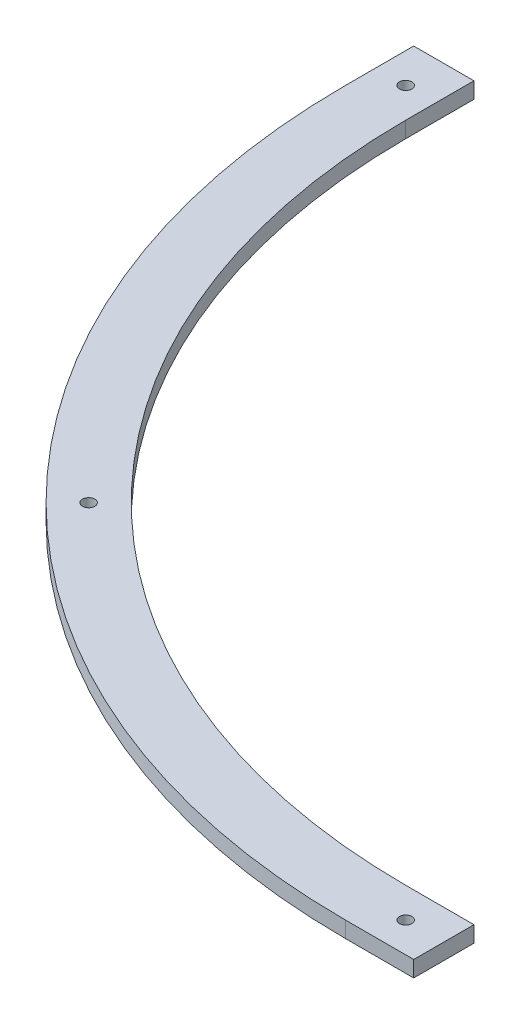
ISO-10303-21;
HEADER;
FILE_DESCRIPTION(('STEP AP214'),'2;1');
FILE_NAME('part.step','',(''),(''),'','','');
FILE_SCHEMA(('AUTOMOTIVE_DESIGN { 1 0 10303 214 1 1 1 1 }'));
ENDSEC;
DATA;
#1=APPLICATION_CONTEXT('core data for automotive mechanical design processes');
#2=APPLICATION_PROTOCOL_DEFINITION('international standard','automotive_design',2000,#1);
#3=PRODUCT_CONTEXT('',#1,'mechanical');
#4=PRODUCT('Part','Part','',(#3));
#5=PRODUCT_RELATED_PRODUCT_CATEGORY('part','',(#4));
#6=PRODUCT_DEFINITION_FORMATION('','',#4);
#7=PRODUCT_DEFINITION_CONTEXT('part definition',#1,'design');
#8=PRODUCT_DEFINITION('design','',#6,#7);
#9=PRODUCT_DEFINITION_SHAPE('','',#8);
#10=(LENGTH_UNIT() NAMED_UNIT(*) SI_UNIT(.MILLI.,.METRE.));
#11=(NAMED_UNIT(*) PLANE_ANGLE_UNIT() SI_UNIT($,.RADIAN.));
#12=(NAMED_UNIT(*) SI_UNIT($,.STERADIAN.) SOLID_ANGLE_UNIT());
#13=UNCERTAINTY_MEASURE_WITH_UNIT(LENGTH_MEASURE(1.E-05),#10,'distance_accuracy_value','');
#14=(GEOMETRIC_REPRESENTATION_CONTEXT(3) GLOBAL_UNCERTAINTY_ASSIGNED_CONTEXT((#13)) GLOBAL_UNIT_ASSIGNED_CONTEXT((#10,
#11,#12)) REPRESENTATION_CONTEXT('',''));
#15=CARTESIAN_POINT('',(0.,0.,0.));
#16=DIRECTION('',(0.,0.,1.));
#17=DIRECTION('',(1.,0.,0.));
#18=AXIS2_PLACEMENT_3D('',#15,#16,#17);
#19=CARTESIAN_POINT('',(90.,4.,-90.));
#20=DIRECTION('',(0.,1.,0.));
#21=DIRECTION('',(0.,0.,1.));
#22=AXIS2_PLACEMENT_3D('',#19,#20,#21);
#23=PLANE('',#22);
#24=CARTESIAN_POINT('',(97.5,4.,82.5));
#25=DIRECTION('',(0.,1.,0.));
#26=DIRECTION('',(0.,0.,1.));
#27=AXIS2_PLACEMENT_3D('',#24,#25,#26);
#28=CIRCLE('',#27,1.54999999999999);
#29=CARTESIAN_POINT('',(97.5,4.,84.05));
#30=VERTEX_POINT('',#29);
#31=EDGE_CURVE('E213',#30,#30,#28,.T.);
#32=ORIENTED_EDGE('',*,*,#31,.F.);
#33=EDGE_LOOP('',(#32));
#34=FACE_BOUND('',#33,.T.);
#35=CARTESIAN_POINT('',(90.,4.,-90.));
#36=DIRECTION('',(0.,1.,0.));
#37=DIRECTION('',(0.,0.,1.));
#38=AXIS2_PLACEMENT_3D('',#35,#36,#37);
#39=CIRCLE('',#38,180.);
#40=CARTESIAN_POINT('',(-90.,4.,-90.));
#41=VERTEX_POINT('',#40);
#42=CARTESIAN_POINT('',(90.,4.,90.));
#43=VERTEX_POINT('',#42);
#44=EDGE_CURVE('E164',#41,#43,#39,.T.);
#45=ORIENTED_EDGE('',*,*,#44,.T.);
#46=DIRECTION('',(1.,0.,0.));
#47=VECTOR('',#46,1.);
#48=CARTESIAN_POINT('',(90.,4.,90.));
#49=LINE('',#48,#47);
#50=CARTESIAN_POINT('',(107.,4.,90.));
#51=VERTEX_POINT('',#50);
#52=EDGE_CURVE('E100',#43,#51,#49,.T.);
#53=ORIENTED_EDGE('',*,*,#52,.T.);
#54=DIRECTION('',(0.,0.,-1.));
#55=VECTOR('',#54,1.);
#56=CARTESIAN_POINT('',(107.,4.,75.));
#57=LINE('',#56,#55);
#58=CARTESIAN_POINT('',(107.,4.,75.));
#59=VERTEX_POINT('',#58);
#60=EDGE_CURVE('E185',#51,#59,#57,.T.);
#61=ORIENTED_EDGE('',*,*,#60,.T.);
#62=DIRECTION('',(-1.,0.,0.));
#63=VECTOR('',#62,1.);
#64=CARTESIAN_POINT('',(90.,4.,75.));
#65=LINE('',#64,#63);
#66=CARTESIAN_POINT('',(90.,4.,75.));
#67=VERTEX_POINT('',#66);
#68=EDGE_CURVE('E199',#59,#67,#65,.T.);
#69=ORIENTED_EDGE('',*,*,#68,.T.);
#70=CARTESIAN_POINT('',(90.,4.,-90.));
#71=DIRECTION('',(0.,-1.,0.));
#72=DIRECTION('',(0.,0.,1.));
#73=AXIS2_PLACEMENT_3D('',#70,#71,#72);
#74=CIRCLE('',#73,165.);
#75=CARTESIAN_POINT('',(-75.,4.,-90.));
#76=VERTEX_POINT('',#75);
#77=EDGE_CURVE('E119',#67,#76,#74,.T.);
#78=ORIENTED_EDGE('',*,*,#77,.T.);
#79=DIRECTION('',(0.,0.,-1.));
#80=VECTOR('',#79,1.);
#81=CARTESIAN_POINT('',(-75.,4.,-90.));
#82=LINE('',#81,#80);
#83=CARTESIAN_POINT('',(-75.,4.,-107.));
#84=VERTEX_POINT('',#83);
#85=EDGE_CURVE('E113',#76,#84,#82,.T.);
#86=ORIENTED_EDGE('',*,*,#85,.T.);
#87=DIRECTION('',(-1.,0.,0.));
#88=VECTOR('',#87,1.);
#89=CARTESIAN_POINT('',(-90.,4.,-107.));
#90=LINE('',#89,#88);
#91=CARTESIAN_POINT('',(-90.,4.,-107.));
#92=VERTEX_POINT('',#91);
#93=EDGE_CURVE('E117',#84,#92,#90,.T.);
#94=ORIENTED_EDGE('',*,*,#93,.T.);
#95=DIRECTION('',(0.,0.,1.));
#96=VECTOR('',#95,1.);
#97=CARTESIAN_POINT('',(-90.,4.,-90.));
#98=LINE('',#97,#96);
#99=EDGE_CURVE('E57',#92,#41,#98,.T.);
#100=ORIENTED_EDGE('',*,*,#99,.T.);
#101=EDGE_LOOP('',(#45,#53,#61,#69,#78,#86,#94,#100));
#102=FACE_BOUND('',#101,.T.);
#103=CARTESIAN_POINT('',(-82.5,4.,-97.5));
#104=DIRECTION('',(0.,1.,0.));
#105=DIRECTION('',(0.,0.,1.));
#106=AXIS2_PLACEMENT_3D('',#103,#104,#105);
#107=CIRCLE('',#106,1.54999999999999);
#108=CARTESIAN_POINT('',(-82.5,4.,-95.95));
#109=VERTEX_POINT('',#108);
#110=EDGE_CURVE('E146',#109,#109,#107,.T.);
#111=ORIENTED_EDGE('',*,*,#110,.F.);
#112=EDGE_LOOP('',(#111));
#113=FACE_BOUND('',#112,.T.);
#114=CARTESIAN_POINT('',(-31.9759197546794,4.,31.9759197546794));
#115=DIRECTION('',(0.,1.,0.));
#116=DIRECTION('',(0.,0.,1.));
#117=AXIS2_PLACEMENT_3D('',#114,#115,#116);
#118=CIRCLE('',#117,1.54999999999999);
#119=CARTESIAN_POINT('',(-31.9759197546794,4.,33.5259197546794));
#120=VERTEX_POINT('',#119);
#121=EDGE_CURVE('E221',#120,#120,#118,.T.);
#122=ORIENTED_EDGE('',*,*,#121,.F.);
#123=EDGE_LOOP('',(#122));
#124=FACE_BOUND('',#123,.T.);
#125=ADVANCED_FACE('F39',(#34,#102,#113,#124),#23,.T.);
#126=CARTESIAN_POINT('',(90.,0.,-90.));
#127=DIRECTION('',(0.,1.,0.));
#128=DIRECTION('',(0.,0.,1.));
#129=AXIS2_PLACEMENT_3D('',#126,#127,#128);
#130=PLANE('',#129);
#131=CARTESIAN_POINT('',(90.,0.,-90.));
#132=DIRECTION('',(0.,1.,0.));
#133=DIRECTION('',(0.,0.,1.));
#134=AXIS2_PLACEMENT_3D('',#131,#132,#133);
#135=CIRCLE('',#134,180.);
#136=CARTESIAN_POINT('',(-90.,0.,-90.));
#137=VERTEX_POINT('',#136);
#138=CARTESIAN_POINT('',(90.,0.,90.));
#139=VERTEX_POINT('',#138);
#140=EDGE_CURVE('E141',#137,#139,#135,.T.);
#141=ORIENTED_EDGE('',*,*,#140,.F.);
#142=DIRECTION('',(0.,0.,1.));
#143=VECTOR('',#142,1.);
#144=CARTESIAN_POINT('',(-90.,0.,-90.));
#145=LINE('',#144,#143);
#146=CARTESIAN_POINT('',(-90.,0.,-107.));
#147=VERTEX_POINT('',#146);
#148=EDGE_CURVE('E92',#147,#137,#145,.T.);
#149=ORIENTED_EDGE('',*,*,#148,.F.);
#150=DIRECTION('',(-1.,0.,0.));
#151=VECTOR('',#150,1.);
#152=CARTESIAN_POINT('',(-90.,0.,-107.));
#153=LINE('',#152,#151);
#154=CARTESIAN_POINT('',(-75.,0.,-107.));
#155=VERTEX_POINT('',#154);
#156=EDGE_CURVE('E86',#155,#147,#153,.T.);
#157=ORIENTED_EDGE('',*,*,#156,.F.);
#158=DIRECTION('',(0.,0.,-1.));
#159=VECTOR('',#158,1.);
#160=CARTESIAN_POINT('',(-75.,0.,-90.));
#161=LINE('',#160,#159);
#162=CARTESIAN_POINT('',(-75.,0.,-90.));
#163=VERTEX_POINT('',#162);
#164=EDGE_CURVE('E128',#163,#155,#161,.T.);
#165=ORIENTED_EDGE('',*,*,#164,.F.);
#166=CARTESIAN_POINT('',(90.,0.,-90.));
#167=DIRECTION('',(0.,-1.,0.));
#168=DIRECTION('',(0.,0.,1.));
#169=AXIS2_PLACEMENT_3D('',#166,#167,#168);
#170=CIRCLE('',#169,165.);
#171=CARTESIAN_POINT('',(90.,0.,75.));
#172=VERTEX_POINT('',#171);
#173=EDGE_CURVE('E155',#172,#163,#170,.T.);
#174=ORIENTED_EDGE('',*,*,#173,.F.);
#175=DIRECTION('',(-1.,0.,0.));
#176=VECTOR('',#175,1.);
#177=CARTESIAN_POINT('',(90.,0.,75.));
#178=LINE('',#177,#176);
#179=CARTESIAN_POINT('',(107.,0.,75.));
#180=VERTEX_POINT('',#179);
#181=EDGE_CURVE('E152',#180,#172,#178,.T.);
#182=ORIENTED_EDGE('',*,*,#181,.F.);
#183=DIRECTION('',(0.,0.,-1.));
#184=VECTOR('',#183,1.);
#185=CARTESIAN_POINT('',(107.,0.,75.));
#186=LINE('',#185,#184);
#187=CARTESIAN_POINT('',(107.,0.,90.));
#188=VERTEX_POINT('',#187);
#189=EDGE_CURVE('E149',#188,#180,#186,.T.);
#190=ORIENTED_EDGE('',*,*,#189,.F.);
#191=DIRECTION('',(1.,0.,0.));
#192=VECTOR('',#191,1.);
#193=CARTESIAN_POINT('',(90.,0.,90.));
#194=LINE('',#193,#192);
#195=EDGE_CURVE('E145',#139,#188,#194,.T.);
#196=ORIENTED_EDGE('',*,*,#195,.F.);
#197=EDGE_LOOP('',(#141,#149,#157,#165,#174,#182,#190,#196));
#198=FACE_BOUND('',#197,.T.);
#199=CARTESIAN_POINT('',(-82.5,0.,-97.5));
#200=DIRECTION('',(0.,1.,0.));
#201=DIRECTION('',(0.,0.,1.));
#202=AXIS2_PLACEMENT_3D('',#199,#200,#201);
#203=CIRCLE('',#202,1.54999999999999);
#204=CARTESIAN_POINT('',(-82.5,0.,-95.95));
#205=VERTEX_POINT('',#204);
#206=EDGE_CURVE('E209',#205,#205,#203,.T.);
#207=ORIENTED_EDGE('',*,*,#206,.T.);
#208=EDGE_LOOP('',(#207));
#209=FACE_BOUND('',#208,.T.);
#210=CARTESIAN_POINT('',(97.5,0.,82.5));
#211=DIRECTION('',(0.,1.,0.));
#212=DIRECTION('',(0.,0.,1.));
#213=AXIS2_PLACEMENT_3D('',#210,#211,#212);
#214=CIRCLE('',#213,1.54999999999999);
#215=CARTESIAN_POINT('',(97.5,0.,84.05));
#216=VERTEX_POINT('',#215);
#217=EDGE_CURVE('E217',#216,#216,#214,.T.);
#218=ORIENTED_EDGE('',*,*,#217,.T.);
#219=EDGE_LOOP('',(#218));
#220=FACE_BOUND('',#219,.T.);
#221=CARTESIAN_POINT('',(-31.9759197546794,0.,31.9759197546794));
#222=DIRECTION('',(0.,1.,0.));
#223=DIRECTION('',(0.,0.,1.));
#224=AXIS2_PLACEMENT_3D('',#221,#222,#223);
#225=CIRCLE('',#224,1.54999999999999);
#226=CARTESIAN_POINT('',(-31.9759197546794,0.,33.5259197546794));
#227=VERTEX_POINT('',#226);
#228=EDGE_CURVE('E225',#227,#227,#225,.T.);
#229=ORIENTED_EDGE('',*,*,#228,.T.);
#230=EDGE_LOOP('',(#229));
#231=FACE_BOUND('',#230,.T.);
#232=ADVANCED_FACE('F189',(#198,#209,#220,#231),#130,.F.);
#233=CARTESIAN_POINT('',(90.,4.,-90.));
#234=DIRECTION('',(0.,-1.,0.));
#235=DIRECTION('',(0.,0.,-1.));
#236=AXIS2_PLACEMENT_3D('',#233,#234,#235);
#237=CYLINDRICAL_SURFACE('',#236,180.);
#238=ORIENTED_EDGE('',*,*,#140,.T.);
#239=DIRECTION('',(0.,-1.,0.));
#240=VECTOR('',#239,1.);
#241=CARTESIAN_POINT('',(90.,4.,90.));
#242=LINE('',#241,#240);
#243=EDGE_CURVE('E11',#43,#139,#242,.T.);
#244=ORIENTED_EDGE('',*,*,#243,.F.);
#245=ORIENTED_EDGE('',*,*,#44,.F.);
#246=DIRECTION('',(0.,-1.,0.));
#247=VECTOR('',#246,1.);
#248=CARTESIAN_POINT('',(-90.,4.,-90.));
#249=LINE('',#248,#247);
#250=EDGE_CURVE('E137',#41,#137,#249,.T.);
#251=ORIENTED_EDGE('',*,*,#250,.T.);
#252=EDGE_LOOP('',(#238,#244,#245,#251));
#253=FACE_BOUND('',#252,.T.);
#254=ADVANCED_FACE('F41',(#253),#237,.T.);
#255=CARTESIAN_POINT('',(90.,4.,90.));
#256=DIRECTION('',(0.,0.,-1.));
#257=DIRECTION('',(-1.,0.,0.));
#258=AXIS2_PLACEMENT_3D('',#255,#256,#257);
#259=PLANE('',#258);
#260=ORIENTED_EDGE('',*,*,#195,.T.);
#261=DIRECTION('',(0.,-1.,0.));
#262=VECTOR('',#261,1.);
#263=CARTESIAN_POINT('',(107.,4.,90.));
#264=LINE('',#263,#262);
#265=EDGE_CURVE('E49',#51,#188,#264,.T.);
#266=ORIENTED_EDGE('',*,*,#265,.F.);
#267=ORIENTED_EDGE('',*,*,#52,.F.);
#268=ORIENTED_EDGE('',*,*,#243,.T.);
#269=EDGE_LOOP('',(#260,#266,#267,#268));
#270=FACE_BOUND('',#269,.T.);
#271=ADVANCED_FACE('F260',(#270),#259,.F.);
#272=CARTESIAN_POINT('',(107.,4.,75.));
#273=DIRECTION('',(-1.,0.,0.));
#274=DIRECTION('',(0.,0.,1.));
#275=AXIS2_PLACEMENT_3D('',#272,#273,#274);
#276=PLANE('',#275);
#277=ORIENTED_EDGE('',*,*,#189,.T.);
#278=DIRECTION('',(0.,-1.,0.));
#279=VECTOR('',#278,1.);
#280=CARTESIAN_POINT('',(107.,4.,75.));
#281=LINE('',#280,#279);
#282=EDGE_CURVE('E175',#59,#180,#281,.T.);
#283=ORIENTED_EDGE('',*,*,#282,.F.);
#284=ORIENTED_EDGE('',*,*,#60,.F.);
#285=ORIENTED_EDGE('',*,*,#265,.T.);
#286=EDGE_LOOP('',(#277,#283,#284,#285));
#287=FACE_BOUND('',#286,.T.);
#288=ADVANCED_FACE('F183',(#287),#276,.F.);
#289=CARTESIAN_POINT('',(90.,4.,75.));
#290=DIRECTION('',(0.,0.,1.));
#291=DIRECTION('',(1.,0.,0.));
#292=AXIS2_PLACEMENT_3D('',#289,#290,#291);
#293=PLANE('',#292);
#294=ORIENTED_EDGE('',*,*,#181,.T.);
#295=DIRECTION('',(0.,-1.,0.));
#296=VECTOR('',#295,1.);
#297=CARTESIAN_POINT('',(90.,4.,75.));
#298=LINE('',#297,#296);
#299=EDGE_CURVE('E171',#67,#172,#298,.T.);
#300=ORIENTED_EDGE('',*,*,#299,.F.);
#301=ORIENTED_EDGE('',*,*,#68,.F.);
#302=ORIENTED_EDGE('',*,*,#282,.T.);
#303=EDGE_LOOP('',(#294,#300,#301,#302));
#304=FACE_BOUND('',#303,.T.);
#305=ADVANCED_FACE('F194',(#304),#293,.F.);
#306=CARTESIAN_POINT('',(90.,4.,-90.));
#307=DIRECTION('',(0.,-1.,0.));
#308=DIRECTION('',(0.,0.,-1.));
#309=AXIS2_PLACEMENT_3D('',#306,#307,#308);
#310=CYLINDRICAL_SURFACE('',#309,165.);
#311=ORIENTED_EDGE('',*,*,#173,.T.);
#312=DIRECTION('',(0.,-1.,0.));
#313=VECTOR('',#312,1.);
#314=CARTESIAN_POINT('',(-75.,4.,-90.));
#315=LINE('',#314,#313);
#316=EDGE_CURVE('E130',#76,#163,#315,.T.);
#317=ORIENTED_EDGE('',*,*,#316,.F.);
#318=ORIENTED_EDGE('',*,*,#77,.F.);
#319=ORIENTED_EDGE('',*,*,#299,.T.);
#320=EDGE_LOOP('',(#311,#317,#318,#319));
#321=FACE_BOUND('',#320,.T.);
#322=ADVANCED_FACE('F197',(#321),#310,.F.);
#323=CARTESIAN_POINT('',(-75.,4.,-90.));
#324=DIRECTION('',(-1.,0.,0.));
#325=DIRECTION('',(0.,0.,1.));
#326=AXIS2_PLACEMENT_3D('',#323,#324,#325);
#327=PLANE('',#326);
#328=ORIENTED_EDGE('',*,*,#164,.T.);
#329=DIRECTION('',(0.,-1.,0.));
#330=VECTOR('',#329,1.);
#331=CARTESIAN_POINT('',(-75.,4.,-107.));
#332=LINE('',#331,#330);
#333=EDGE_CURVE('E125',#84,#155,#332,.T.);
#334=ORIENTED_EDGE('',*,*,#333,.F.);
#335=ORIENTED_EDGE('',*,*,#85,.F.);
#336=ORIENTED_EDGE('',*,*,#316,.T.);
#337=EDGE_LOOP('',(#328,#334,#335,#336));
#338=FACE_BOUND('',#337,.T.);
#339=ADVANCED_FACE('F126',(#338),#327,.F.);
#340=CARTESIAN_POINT('',(-90.,4.,-107.));
#341=DIRECTION('',(0.,0.,1.));
#342=DIRECTION('',(1.,0.,0.));
#343=AXIS2_PLACEMENT_3D('',#340,#341,#342);
#344=PLANE('',#343);
#345=ORIENTED_EDGE('',*,*,#156,.T.);
#346=DIRECTION('',(0.,-1.,0.));
#347=VECTOR('',#346,1.);
#348=CARTESIAN_POINT('',(-90.,4.,-107.));
#349=LINE('',#348,#347);
#350=EDGE_CURVE('E131',#92,#147,#349,.T.);
#351=ORIENTED_EDGE('',*,*,#350,.F.);
#352=ORIENTED_EDGE('',*,*,#93,.F.);
#353=ORIENTED_EDGE('',*,*,#333,.T.);
#354=EDGE_LOOP('',(#345,#351,#352,#353));
#355=FACE_BOUND('',#354,.T.);
#356=ADVANCED_FACE('F133',(#355),#344,.F.);
#357=CARTESIAN_POINT('',(-90.,4.,-90.));
#358=DIRECTION('',(1.,0.,0.));
#359=DIRECTION('',(0.,0.,-1.));
#360=AXIS2_PLACEMENT_3D('',#357,#358,#359);
#361=PLANE('',#360);
#362=ORIENTED_EDGE('',*,*,#148,.T.);
#363=ORIENTED_EDGE('',*,*,#250,.F.);
#364=ORIENTED_EDGE('',*,*,#99,.F.);
#365=ORIENTED_EDGE('',*,*,#350,.T.);
#366=EDGE_LOOP('',(#362,#363,#364,#365));
#367=FACE_BOUND('',#366,.T.);
#368=ADVANCED_FACE('F248',(#367),#361,.F.);
#369=CARTESIAN_POINT('',(-82.5,4.,-97.5));
#370=DIRECTION('',(0.,-1.,0.));
#371=DIRECTION('',(0.,0.,-1.));
#372=AXIS2_PLACEMENT_3D('',#369,#370,#371);
#373=CYLINDRICAL_SURFACE('',#372,1.54999999999999);
#374=ORIENTED_EDGE('',*,*,#110,.T.);
#375=EDGE_LOOP('',(#374));
#376=FACE_BOUND('',#375,.T.);
#377=ORIENTED_EDGE('',*,*,#206,.F.);
#378=EDGE_LOOP('',(#377));
#379=FACE_BOUND('',#378,.T.);
#380=ADVANCED_FACE('F245',(#376,#379),#373,.F.);
#381=CARTESIAN_POINT('',(97.5,4.,82.5));
#382=DIRECTION('',(0.,-1.,0.));
#383=DIRECTION('',(0.,0.,-1.));
#384=AXIS2_PLACEMENT_3D('',#381,#382,#383);
#385=CYLINDRICAL_SURFACE('',#384,1.54999999999999);
#386=ORIENTED_EDGE('',*,*,#31,.T.);
#387=EDGE_LOOP('',(#386));
#388=FACE_BOUND('',#387,.T.);
#389=ORIENTED_EDGE('',*,*,#217,.F.);
#390=EDGE_LOOP('',(#389));
#391=FACE_BOUND('',#390,.T.);
#392=ADVANCED_FACE('F324',(#388,#391),#385,.F.);
#393=CARTESIAN_POINT('',(-31.9759197546794,4.,31.9759197546794));
#394=DIRECTION('',(0.,-1.,0.));
#395=DIRECTION('',(0.,0.,-1.));
#396=AXIS2_PLACEMENT_3D('',#393,#394,#395);
#397=CYLINDRICAL_SURFACE('',#396,1.54999999999999);
#398=ORIENTED_EDGE('',*,*,#121,.T.);
#399=EDGE_LOOP('',(#398));
#400=FACE_BOUND('',#399,.T.);
#401=ORIENTED_EDGE('',*,*,#228,.F.);
#402=EDGE_LOOP('',(#401));
#403=FACE_BOUND('',#402,.T.);
#404=ADVANCED_FACE('F233',(#400,#403),#397,.F.);
#405=CLOSED_SHELL('',(#125,#232,#254,#271,#288,#305,#322,#339,#356,#368,#380,#392,#404));
#406=MANIFOLD_SOLID_BREP('B2',#405);
#407=ADVANCED_BREP_SHAPE_REPRESENTATION('',(#18,#406),#14);
#408=SHAPE_DEFINITION_REPRESENTATION(#9,#407);
ENDSEC;
END-ISO-10303-21;
